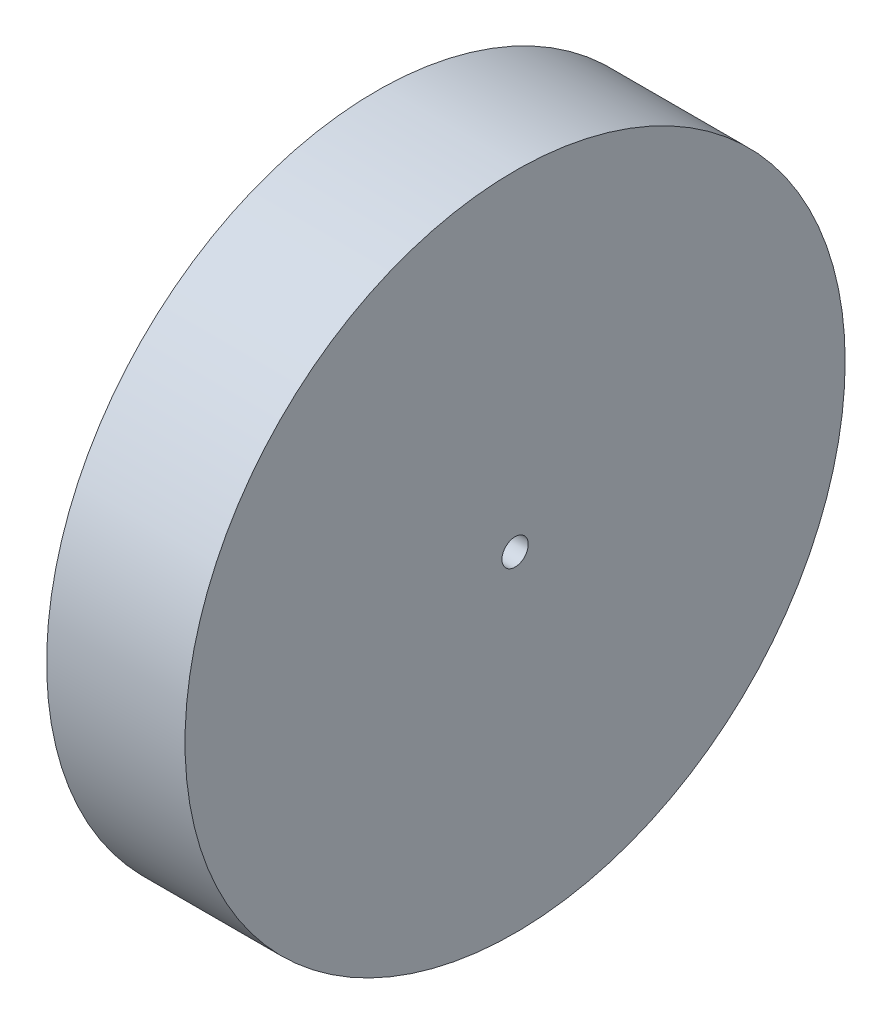
ISO-10303-21;
HEADER;
FILE_DESCRIPTION(('STEP AP214'),'2;1');
FILE_NAME('part.step','',(''),(''),'','','');
FILE_SCHEMA(('AUTOMOTIVE_DESIGN { 1 0 10303 214 1 1 1 1 }'));
ENDSEC;
DATA;
#1=APPLICATION_CONTEXT('core data for automotive mechanical design processes');
#2=APPLICATION_PROTOCOL_DEFINITION('international standard','automotive_design',2000,#1);
#3=PRODUCT_CONTEXT('',#1,'mechanical');
#4=PRODUCT('Part','Part','',(#3));
#5=PRODUCT_RELATED_PRODUCT_CATEGORY('part','',(#4));
#6=PRODUCT_DEFINITION_FORMATION('','',#4);
#7=PRODUCT_DEFINITION_CONTEXT('part definition',#1,'design');
#8=PRODUCT_DEFINITION('design','',#6,#7);
#9=PRODUCT_DEFINITION_SHAPE('','',#8);
#10=(LENGTH_UNIT() NAMED_UNIT(*) SI_UNIT(.MILLI.,.METRE.));
#11=(NAMED_UNIT(*) PLANE_ANGLE_UNIT() SI_UNIT($,.RADIAN.));
#12=(NAMED_UNIT(*) SI_UNIT($,.STERADIAN.) SOLID_ANGLE_UNIT());
#13=UNCERTAINTY_MEASURE_WITH_UNIT(LENGTH_MEASURE(1.E-05),#10,'distance_accuracy_value','');
#14=(GEOMETRIC_REPRESENTATION_CONTEXT(3) GLOBAL_UNCERTAINTY_ASSIGNED_CONTEXT((#13)) GLOBAL_UNIT_ASSIGNED_CONTEXT((#10,
#11,#12)) REPRESENTATION_CONTEXT('',''));
#15=CARTESIAN_POINT('',(0.,0.,0.));
#16=DIRECTION('',(0.,0.,1.));
#17=DIRECTION('',(1.,0.,0.));
#18=AXIS2_PLACEMENT_3D('',#15,#16,#17);
#19=CARTESIAN_POINT('',(121.,0.,0.));
#20=DIRECTION('',(-1.,0.,0.));
#21=DIRECTION('',(0.,0.,1.));
#22=AXIS2_PLACEMENT_3D('',#19,#20,#21);
#23=CYLINDRICAL_SURFACE('',#22,288.6);
#24=CARTESIAN_POINT('',(121.,0.,0.));
#25=DIRECTION('',(1.,0.,0.));
#26=DIRECTION('',(0.,0.,-1.));
#27=AXIS2_PLACEMENT_3D('',#24,#25,#26);
#28=CIRCLE('',#27,288.6);
#29=CARTESIAN_POINT('',(121.,0.,-288.6));
#30=VERTEX_POINT('',#29);
#31=EDGE_CURVE('E10',#30,#30,#28,.T.);
#32=ORIENTED_EDGE('',*,*,#31,.F.);
#33=EDGE_LOOP('',(#32));
#34=FACE_BOUND('',#33,.T.);
#35=CARTESIAN_POINT('',(0.,0.,0.));
#36=DIRECTION('',(1.,0.,0.));
#37=DIRECTION('',(0.,0.,-1.));
#38=AXIS2_PLACEMENT_3D('',#35,#36,#37);
#39=CIRCLE('',#38,288.6);
#40=CARTESIAN_POINT('',(0.,0.,-288.6));
#41=VERTEX_POINT('',#40);
#42=EDGE_CURVE('E40',#41,#41,#39,.T.);
#43=ORIENTED_EDGE('',*,*,#42,.T.);
#44=EDGE_LOOP('',(#43));
#45=FACE_BOUND('',#44,.T.);
#46=ADVANCED_FACE('F37',(#34,#45),#23,.T.);
#47=CARTESIAN_POINT('',(121.,0.,0.));
#48=DIRECTION('',(1.,0.,0.));
#49=DIRECTION('',(0.,0.,-1.));
#50=AXIS2_PLACEMENT_3D('',#47,#48,#49);
#51=PLANE('',#50);
#52=CARTESIAN_POINT('',(121.,0.,0.));
#53=DIRECTION('',(-1.,0.,0.));
#54=DIRECTION('',(0.,0.,1.));
#55=AXIS2_PLACEMENT_3D('',#52,#53,#54);
#56=CIRCLE('',#55,11.5);
#57=CARTESIAN_POINT('',(121.,0.,11.5));
#58=VERTEX_POINT('',#57);
#59=EDGE_CURVE('E49',#58,#58,#56,.T.);
#60=ORIENTED_EDGE('',*,*,#59,.T.);
#61=EDGE_LOOP('',(#60));
#62=FACE_BOUND('',#61,.T.);
#63=ORIENTED_EDGE('',*,*,#31,.T.);
#64=EDGE_LOOP('',(#63));
#65=FACE_BOUND('',#64,.T.);
#66=ADVANCED_FACE('F59',(#62,#65),#51,.T.);
#67=CARTESIAN_POINT('',(0.,0.,0.));
#68=DIRECTION('',(1.,0.,0.));
#69=DIRECTION('',(0.,0.,-1.));
#70=AXIS2_PLACEMENT_3D('',#67,#68,#69);
#71=PLANE('',#70);
#72=CARTESIAN_POINT('',(0.,0.,0.));
#73=DIRECTION('',(-1.,0.,0.));
#74=DIRECTION('',(0.,0.,1.));
#75=AXIS2_PLACEMENT_3D('',#72,#73,#74);
#76=CIRCLE('',#75,11.5);
#77=CARTESIAN_POINT('',(0.,0.,11.5));
#78=VERTEX_POINT('',#77);
#79=EDGE_CURVE('E51',#78,#78,#76,.T.);
#80=ORIENTED_EDGE('',*,*,#79,.F.);
#81=EDGE_LOOP('',(#80));
#82=FACE_BOUND('',#81,.T.);
#83=ORIENTED_EDGE('',*,*,#42,.F.);
#84=EDGE_LOOP('',(#83));
#85=FACE_BOUND('',#84,.T.);
#86=ADVANCED_FACE('F64',(#82,#85),#71,.F.);
#87=CARTESIAN_POINT('',(121.,0.,0.));
#88=DIRECTION('',(-1.,0.,0.));
#89=DIRECTION('',(0.,0.,1.));
#90=AXIS2_PLACEMENT_3D('',#87,#88,#89);
#91=CYLINDRICAL_SURFACE('',#90,11.5);
#92=ORIENTED_EDGE('',*,*,#59,.F.);
#93=EDGE_LOOP('',(#92));
#94=FACE_BOUND('',#93,.T.);
#95=ORIENTED_EDGE('',*,*,#79,.T.);
#96=EDGE_LOOP('',(#95));
#97=FACE_BOUND('',#96,.T.);
#98=ADVANCED_FACE('F61',(#94,#97),#91,.F.);
#99=CLOSED_SHELL('',(#46,#66,#86,#98));
#100=MANIFOLD_SOLID_BREP('B2',#99);
#101=ADVANCED_BREP_SHAPE_REPRESENTATION('',(#18,#100),#14);
#102=SHAPE_DEFINITION_REPRESENTATION(#9,#101);
ENDSEC;
END-ISO-10303-21;
